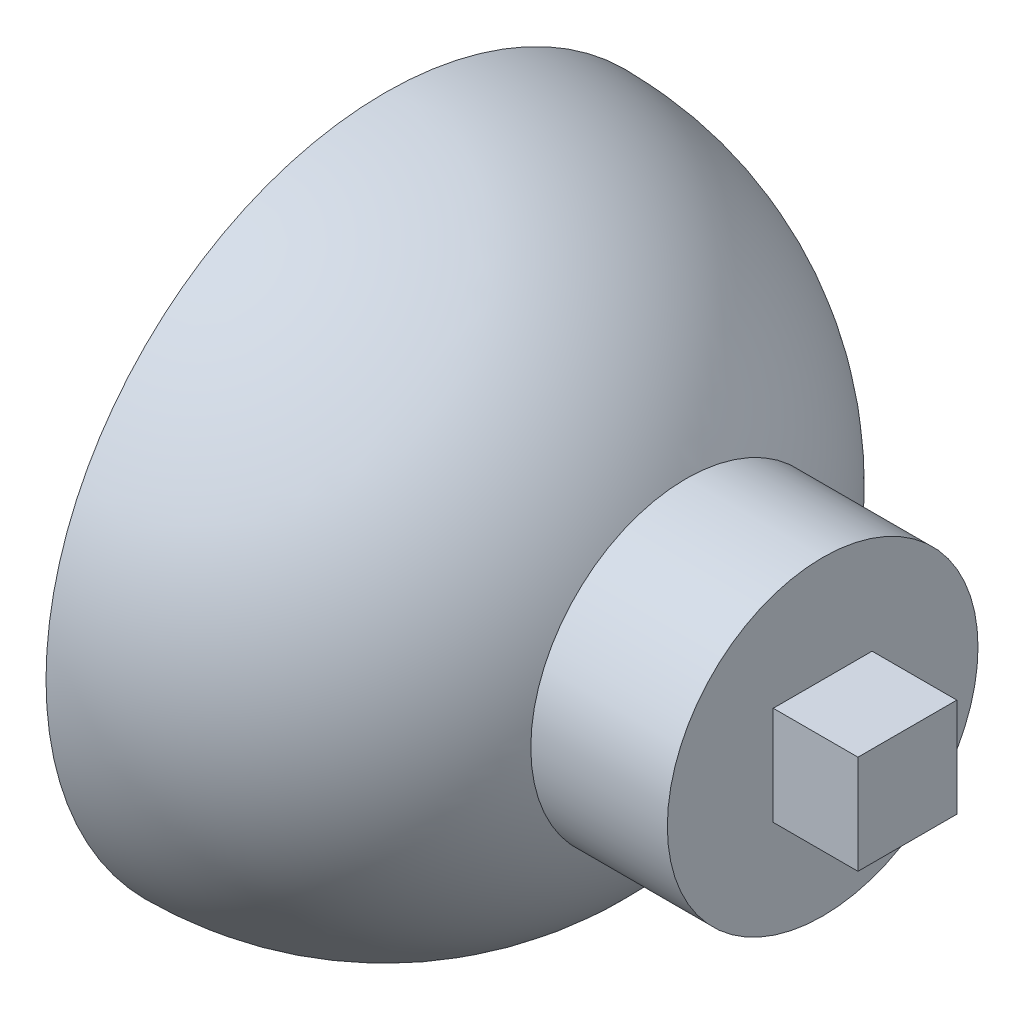
ISO-10303-21;
HEADER;
FILE_DESCRIPTION(('STEP AP214'),'2;1');
FILE_NAME('part.step','',(''),(''),'','','');
FILE_SCHEMA(('AUTOMOTIVE_DESIGN { 1 0 10303 214 1 1 1 1 }'));
ENDSEC;
DATA;
#1=APPLICATION_CONTEXT('core data for automotive mechanical design processes');
#2=APPLICATION_PROTOCOL_DEFINITION('international standard','automotive_design',2000,#1);
#3=PRODUCT_CONTEXT('',#1,'mechanical');
#4=PRODUCT('Part','Part','',(#3));
#5=PRODUCT_RELATED_PRODUCT_CATEGORY('part','',(#4));
#6=PRODUCT_DEFINITION_FORMATION('','',#4);
#7=PRODUCT_DEFINITION_CONTEXT('part definition',#1,'design');
#8=PRODUCT_DEFINITION('design','',#6,#7);
#9=PRODUCT_DEFINITION_SHAPE('','',#8);
#10=(LENGTH_UNIT() NAMED_UNIT(*) SI_UNIT(.MILLI.,.METRE.));
#11=(NAMED_UNIT(*) PLANE_ANGLE_UNIT() SI_UNIT($,.RADIAN.));
#12=(NAMED_UNIT(*) SI_UNIT($,.STERADIAN.) SOLID_ANGLE_UNIT());
#13=UNCERTAINTY_MEASURE_WITH_UNIT(LENGTH_MEASURE(1.E-05),#10,'distance_accuracy_value','');
#14=(GEOMETRIC_REPRESENTATION_CONTEXT(3) GLOBAL_UNCERTAINTY_ASSIGNED_CONTEXT((#13)) GLOBAL_UNIT_ASSIGNED_CONTEXT((#10,
#11,#12)) REPRESENTATION_CONTEXT('',''));
#15=CARTESIAN_POINT('',(0.,0.,0.));
#16=DIRECTION('',(0.,0.,1.));
#17=DIRECTION('',(1.,0.,0.));
#18=AXIS2_PLACEMENT_3D('',#15,#16,#17);
#19=CARTESIAN_POINT('',(30.9999999999999,0.,0.));
#20=DIRECTION('',(-1.,0.,0.));
#21=DIRECTION('',(0.,0.,1.));
#22=AXIS2_PLACEMENT_3D('',#19,#20,#21);
#23=PLANE('',#22);
#24=CARTESIAN_POINT('',(30.9999999999999,0.,0.));
#25=DIRECTION('',(-1.,0.,0.));
#26=DIRECTION('',(0.,0.,1.));
#27=AXIS2_PLACEMENT_3D('',#24,#25,#26);
#28=CIRCLE('',#27,11.);
#29=CARTESIAN_POINT('',(30.9999999999999,0.,11.));
#30=VERTEX_POINT('',#29);
#31=EDGE_CURVE('E97',#30,#30,#28,.T.);
#32=ORIENTED_EDGE('',*,*,#31,.F.);
#33=EDGE_LOOP('',(#32));
#34=FACE_BOUND('',#33,.T.);
#35=DIRECTION('',(0.,1.,0.));
#36=VECTOR('',#35,1.);
#37=CARTESIAN_POINT('',(30.9999999999999,-3.5,-3.5));
#38=LINE('',#37,#36);
#39=CARTESIAN_POINT('',(30.9999999999999,-3.5,-3.5));
#40=VERTEX_POINT('',#39);
#41=CARTESIAN_POINT('',(30.9999999999999,3.5,-3.5));
#42=VERTEX_POINT('',#41);
#43=EDGE_CURVE('E51',#40,#42,#38,.T.);
#44=ORIENTED_EDGE('',*,*,#43,.F.);
#45=DIRECTION('',(0.,0.,-1.));
#46=VECTOR('',#45,1.);
#47=CARTESIAN_POINT('',(30.9999999999999,-3.5,3.5));
#48=LINE('',#47,#46);
#49=CARTESIAN_POINT('',(30.9999999999999,-3.5,3.5));
#50=VERTEX_POINT('',#49);
#51=EDGE_CURVE('E55',#50,#40,#48,.T.);
#52=ORIENTED_EDGE('',*,*,#51,.F.);
#53=DIRECTION('',(0.,-1.,0.));
#54=VECTOR('',#53,1.);
#55=CARTESIAN_POINT('',(30.9999999999999,-3.5,3.5));
#56=LINE('',#55,#54);
#57=CARTESIAN_POINT('',(30.9999999999999,3.5,3.5));
#58=VERTEX_POINT('',#57);
#59=EDGE_CURVE('E227',#58,#50,#56,.T.);
#60=ORIENTED_EDGE('',*,*,#59,.F.);
#61=DIRECTION('',(0.,0.,1.));
#62=VECTOR('',#61,1.);
#63=CARTESIAN_POINT('',(30.9999999999999,3.5,3.5));
#64=LINE('',#63,#62);
#65=EDGE_CURVE('E233',#42,#58,#64,.T.);
#66=ORIENTED_EDGE('',*,*,#65,.F.);
#67=EDGE_LOOP('',(#44,#52,#60,#66));
#68=FACE_BOUND('',#67,.T.);
#69=ADVANCED_FACE('F36',(#34,#68),#23,.F.);
#70=CARTESIAN_POINT('',(0.,0.,0.));
#71=DIRECTION('',(-1.,0.,0.));
#72=DIRECTION('',(0.,1.,0.));
#73=AXIS2_PLACEMENT_3D('',#70,#71,#72);
#74=SPHERICAL_SURFACE('',#73,24.);
#75=CARTESIAN_POINT('',(0.,0.,0.));
#76=DIRECTION('',(-1.,0.,0.));
#77=DIRECTION('',(0.,0.,1.));
#78=AXIS2_PLACEMENT_3D('',#75,#76,#77);
#79=CIRCLE('',#78,24.);
#80=CARTESIAN_POINT('',(0.,0.,24.));
#81=VERTEX_POINT('',#80);
#82=EDGE_CURVE('E44',#81,#81,#79,.T.);
#83=ORIENTED_EDGE('',*,*,#82,.F.);
#84=EDGE_LOOP('',(#83));
#85=FACE_BOUND('',#84,.T.);
#86=CARTESIAN_POINT('',(21.3307290077015,0.,0.));
#87=DIRECTION('',(-1.,0.,0.));
#88=DIRECTION('',(0.,0.,1.));
#89=AXIS2_PLACEMENT_3D('',#86,#87,#88);
#90=CIRCLE('',#89,11.);
#91=CARTESIAN_POINT('',(21.3307290077015,0.,11.));
#92=VERTEX_POINT('',#91);
#93=EDGE_CURVE('E11',#92,#92,#90,.F.);
#94=ORIENTED_EDGE('',*,*,#93,.F.);
#95=EDGE_LOOP('',(#94));
#96=FACE_BOUND('',#95,.T.);
#97=ADVANCED_FACE('F38',(#85,#96),#74,.T.);
#98=CARTESIAN_POINT('',(0.,20.,0.));
#99=DIRECTION('',(-1.,0.,0.));
#100=DIRECTION('',(0.,0.,1.));
#101=AXIS2_PLACEMENT_3D('',#98,#99,#100);
#102=PLANE('',#101);
#103=ORIENTED_EDGE('',*,*,#82,.T.);
#104=EDGE_LOOP('',(#103));
#105=FACE_BOUND('',#104,.T.);
#106=CARTESIAN_POINT('',(0.,0.,0.));
#107=DIRECTION('',(-1.,0.,0.));
#108=DIRECTION('',(0.,0.,1.));
#109=AXIS2_PLACEMENT_3D('',#106,#107,#108);
#110=CIRCLE('',#109,20.);
#111=CARTESIAN_POINT('',(0.,0.,20.));
#112=VERTEX_POINT('',#111);
#113=EDGE_CURVE('E100',#112,#112,#110,.T.);
#114=ORIENTED_EDGE('',*,*,#113,.F.);
#115=EDGE_LOOP('',(#114));
#116=FACE_BOUND('',#115,.T.);
#117=ADVANCED_FACE('F110',(#105,#116),#102,.T.);
#118=CARTESIAN_POINT('',(0.,0.,0.));
#119=DIRECTION('',(-1.,0.,0.));
#120=DIRECTION('',(0.,1.,0.));
#121=AXIS2_PLACEMENT_3D('',#118,#119,#120);
#122=SPHERICAL_SURFACE('',#121,20.);
#123=ORIENTED_EDGE('',*,*,#113,.T.);
#124=EDGE_LOOP('',(#123));
#125=FACE_BOUND('',#124,.T.);
#126=ADVANCED_FACE('F120',(#125),#122,.F.);
#127=CARTESIAN_POINT('',(-24.001,0.,0.));
#128=DIRECTION('',(1.,0.,0.));
#129=DIRECTION('',(0.,0.,-1.));
#130=AXIS2_PLACEMENT_3D('',#127,#128,#129);
#131=CYLINDRICAL_SURFACE('',#130,11.);
#132=ORIENTED_EDGE('',*,*,#93,.T.);
#133=EDGE_LOOP('',(#132));
#134=FACE_BOUND('',#133,.T.);
#135=ORIENTED_EDGE('',*,*,#31,.T.);
#136=EDGE_LOOP('',(#135));
#137=FACE_BOUND('',#136,.T.);
#138=ADVANCED_FACE('F117',(#134,#137),#131,.T.);
#139=CARTESIAN_POINT('',(36.9999999999999,-3.5,-3.5));
#140=DIRECTION('',(0.,0.,1.));
#141=DIRECTION('',(1.,0.,0.));
#142=AXIS2_PLACEMENT_3D('',#139,#140,#141);
#143=PLANE('',#142);
#144=ORIENTED_EDGE('',*,*,#43,.T.);
#145=DIRECTION('',(-1.,0.,0.));
#146=VECTOR('',#145,1.);
#147=CARTESIAN_POINT('',(36.9999999999999,3.5,-3.5));
#148=LINE('',#147,#146);
#149=CARTESIAN_POINT('',(36.9999999999999,3.5,-3.5));
#150=VERTEX_POINT('',#149);
#151=EDGE_CURVE('E80',#150,#42,#148,.T.);
#152=ORIENTED_EDGE('',*,*,#151,.F.);
#153=DIRECTION('',(0.,1.,0.));
#154=VECTOR('',#153,1.);
#155=CARTESIAN_POINT('',(36.9999999999999,-3.5,-3.5));
#156=LINE('',#155,#154);
#157=CARTESIAN_POINT('',(36.9999999999999,-3.5,-3.5));
#158=VERTEX_POINT('',#157);
#159=EDGE_CURVE('E86',#158,#150,#156,.T.);
#160=ORIENTED_EDGE('',*,*,#159,.F.);
#161=DIRECTION('',(-1.,0.,0.));
#162=VECTOR('',#161,1.);
#163=CARTESIAN_POINT('',(36.9999999999999,-3.5,-3.5));
#164=LINE('',#163,#162);
#165=EDGE_CURVE('E225',#158,#40,#164,.T.);
#166=ORIENTED_EDGE('',*,*,#165,.T.);
#167=EDGE_LOOP('',(#144,#152,#160,#166));
#168=FACE_BOUND('',#167,.T.);
#169=ADVANCED_FACE('F96',(#168),#143,.F.);
#170=CARTESIAN_POINT('',(36.9999999999999,3.5,3.5));
#171=DIRECTION('',(0.,-1.,0.));
#172=DIRECTION('',(0.,0.,-1.));
#173=AXIS2_PLACEMENT_3D('',#170,#171,#172);
#174=PLANE('',#173);
#175=ORIENTED_EDGE('',*,*,#65,.T.);
#176=DIRECTION('',(-1.,0.,0.));
#177=VECTOR('',#176,1.);
#178=CARTESIAN_POINT('',(36.9999999999999,3.5,3.5));
#179=LINE('',#178,#177);
#180=CARTESIAN_POINT('',(36.9999999999999,3.5,3.5));
#181=VERTEX_POINT('',#180);
#182=EDGE_CURVE('E82',#181,#58,#179,.T.);
#183=ORIENTED_EDGE('',*,*,#182,.F.);
#184=DIRECTION('',(0.,0.,1.));
#185=VECTOR('',#184,1.);
#186=CARTESIAN_POINT('',(36.9999999999999,3.5,3.5));
#187=LINE('',#186,#185);
#188=EDGE_CURVE('E75',#150,#181,#187,.T.);
#189=ORIENTED_EDGE('',*,*,#188,.F.);
#190=ORIENTED_EDGE('',*,*,#151,.T.);
#191=EDGE_LOOP('',(#175,#183,#189,#190));
#192=FACE_BOUND('',#191,.T.);
#193=ADVANCED_FACE('F78',(#192),#174,.F.);
#194=CARTESIAN_POINT('',(36.9999999999999,-3.5,3.5));
#195=DIRECTION('',(0.,0.,-1.));
#196=DIRECTION('',(-1.,0.,0.));
#197=AXIS2_PLACEMENT_3D('',#194,#195,#196);
#198=PLANE('',#197);
#199=ORIENTED_EDGE('',*,*,#59,.T.);
#200=DIRECTION('',(-1.,0.,0.));
#201=VECTOR('',#200,1.);
#202=CARTESIAN_POINT('',(36.9999999999999,-3.5,3.5));
#203=LINE('',#202,#201);
#204=CARTESIAN_POINT('',(36.9999999999999,-3.5,3.5));
#205=VERTEX_POINT('',#204);
#206=EDGE_CURVE('E102',#205,#50,#203,.T.);
#207=ORIENTED_EDGE('',*,*,#206,.F.);
#208=DIRECTION('',(0.,-1.,0.));
#209=VECTOR('',#208,1.);
#210=CARTESIAN_POINT('',(36.9999999999999,-3.5,3.5));
#211=LINE('',#210,#209);
#212=EDGE_CURVE('E85',#181,#205,#211,.T.);
#213=ORIENTED_EDGE('',*,*,#212,.F.);
#214=ORIENTED_EDGE('',*,*,#182,.T.);
#215=EDGE_LOOP('',(#199,#207,#213,#214));
#216=FACE_BOUND('',#215,.T.);
#217=ADVANCED_FACE('F157',(#216),#198,.F.);
#218=CARTESIAN_POINT('',(36.9999999999999,-3.5,3.5));
#219=DIRECTION('',(0.,1.,0.));
#220=DIRECTION('',(0.,0.,1.));
#221=AXIS2_PLACEMENT_3D('',#218,#219,#220);
#222=PLANE('',#221);
#223=ORIENTED_EDGE('',*,*,#51,.T.);
#224=ORIENTED_EDGE('',*,*,#165,.F.);
#225=DIRECTION('',(0.,0.,-1.));
#226=VECTOR('',#225,1.);
#227=CARTESIAN_POINT('',(36.9999999999999,-3.5,3.5));
#228=LINE('',#227,#226);
#229=EDGE_CURVE('E91',#205,#158,#228,.T.);
#230=ORIENTED_EDGE('',*,*,#229,.F.);
#231=ORIENTED_EDGE('',*,*,#206,.T.);
#232=EDGE_LOOP('',(#223,#224,#230,#231));
#233=FACE_BOUND('',#232,.T.);
#234=ADVANCED_FACE('F163',(#233),#222,.F.);
#235=CARTESIAN_POINT('',(36.9999999999999,0.,0.));
#236=DIRECTION('',(-1.,0.,0.));
#237=DIRECTION('',(0.,0.,1.));
#238=AXIS2_PLACEMENT_3D('',#235,#236,#237);
#239=PLANE('',#238);
#240=ORIENTED_EDGE('',*,*,#159,.T.);
#241=ORIENTED_EDGE('',*,*,#188,.T.);
#242=ORIENTED_EDGE('',*,*,#212,.T.);
#243=ORIENTED_EDGE('',*,*,#229,.T.);
#244=EDGE_LOOP('',(#240,#241,#242,#243));
#245=FACE_BOUND('',#244,.T.);
#246=ADVANCED_FACE('F89',(#245),#239,.F.);
#247=CLOSED_SHELL('',(#69,#97,#117,#126,#138,#169,#193,#217,#234,#246));
#248=MANIFOLD_SOLID_BREP('B2',#247);
#249=ADVANCED_BREP_SHAPE_REPRESENTATION('',(#18,#248),#14);
#250=SHAPE_DEFINITION_REPRESENTATION(#9,#249);
ENDSEC;
END-ISO-10303-21;
